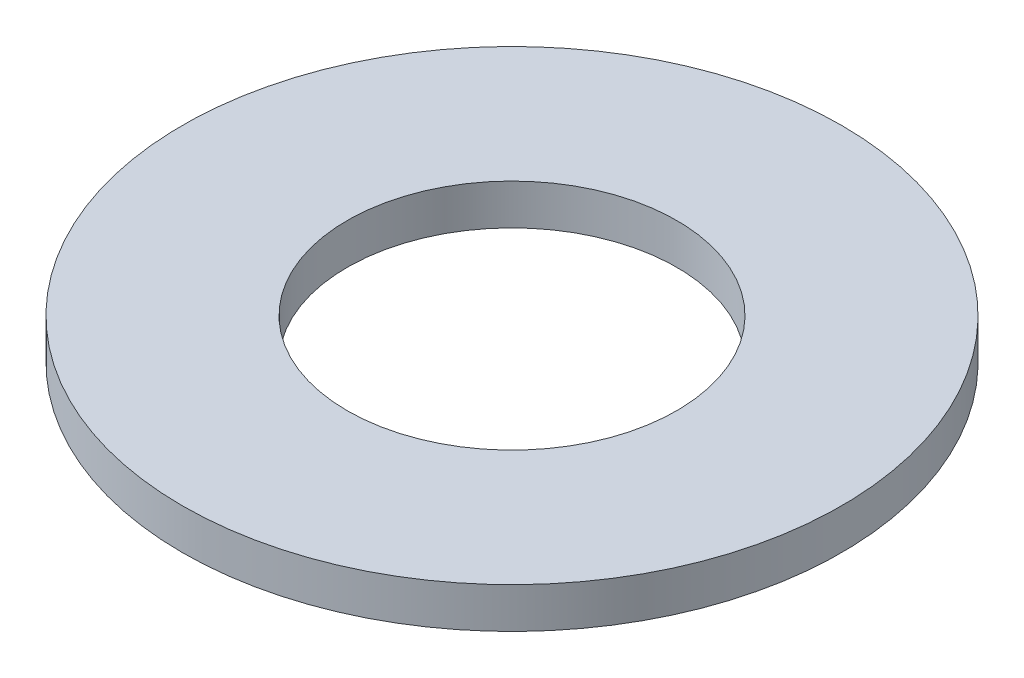
ISO-10303-21;
HEADER;
FILE_DESCRIPTION(('STEP AP214'),'2;1');
FILE_NAME('part.step','',(''),(''),'','','');
FILE_SCHEMA(('AUTOMOTIVE_DESIGN { 1 0 10303 214 1 1 1 1 }'));
ENDSEC;
DATA;
#1=APPLICATION_CONTEXT('core data for automotive mechanical design processes');
#2=APPLICATION_PROTOCOL_DEFINITION('international standard','automotive_design',2000,#1);
#3=PRODUCT_CONTEXT('',#1,'mechanical');
#4=PRODUCT('Part','Part','',(#3));
#5=PRODUCT_RELATED_PRODUCT_CATEGORY('part','',(#4));
#6=PRODUCT_DEFINITION_FORMATION('','',#4);
#7=PRODUCT_DEFINITION_CONTEXT('part definition',#1,'design');
#8=PRODUCT_DEFINITION('design','',#6,#7);
#9=PRODUCT_DEFINITION_SHAPE('','',#8);
#10=(LENGTH_UNIT() NAMED_UNIT(*) SI_UNIT(.MILLI.,.METRE.));
#11=(NAMED_UNIT(*) PLANE_ANGLE_UNIT() SI_UNIT($,.RADIAN.));
#12=(NAMED_UNIT(*) SI_UNIT($,.STERADIAN.) SOLID_ANGLE_UNIT());
#13=UNCERTAINTY_MEASURE_WITH_UNIT(LENGTH_MEASURE(1.E-05),#10,'distance_accuracy_value','');
#14=(GEOMETRIC_REPRESENTATION_CONTEXT(3) GLOBAL_UNCERTAINTY_ASSIGNED_CONTEXT((#13)) GLOBAL_UNIT_ASSIGNED_CONTEXT((#10,
#11,#12)) REPRESENTATION_CONTEXT('',''));
#15=CARTESIAN_POINT('',(0.,0.,0.));
#16=DIRECTION('',(0.,0.,1.));
#17=DIRECTION('',(1.,0.,0.));
#18=AXIS2_PLACEMENT_3D('',#15,#16,#17);
#19=CARTESIAN_POINT('',(0.,0.8,0.));
#20=DIRECTION('',(0.,1.,0.));
#21=DIRECTION('',(0.,0.,1.));
#22=AXIS2_PLACEMENT_3D('',#19,#20,#21);
#23=PLANE('',#22);
#24=CARTESIAN_POINT('',(0.,0.8,0.));
#25=DIRECTION('',(0.,1.,0.));
#26=DIRECTION('',(0.,0.,1.));
#27=AXIS2_PLACEMENT_3D('',#24,#25,#26);
#28=CIRCLE('',#27,6.5);
#29=CARTESIAN_POINT('',(0.,0.8,6.5));
#30=VERTEX_POINT('',#29);
#31=EDGE_CURVE('E10',#30,#30,#28,.T.);
#32=ORIENTED_EDGE('',*,*,#31,.T.);
#33=EDGE_LOOP('',(#32));
#34=FACE_BOUND('',#33,.T.);
#35=CARTESIAN_POINT('',(0.,0.8,0.));
#36=DIRECTION('',(0.,1.,0.));
#37=DIRECTION('',(0.,0.,1.));
#38=AXIS2_PLACEMENT_3D('',#35,#36,#37);
#39=CIRCLE('',#38,3.25);
#40=CARTESIAN_POINT('',(0.,0.8,3.25));
#41=VERTEX_POINT('',#40);
#42=EDGE_CURVE('E48',#41,#41,#39,.T.);
#43=ORIENTED_EDGE('',*,*,#42,.F.);
#44=EDGE_LOOP('',(#43));
#45=FACE_BOUND('',#44,.T.);
#46=ADVANCED_FACE('F37',(#34,#45),#23,.T.);
#47=CARTESIAN_POINT('',(0.,0.,0.));
#48=DIRECTION('',(0.,1.,0.));
#49=DIRECTION('',(0.,0.,1.));
#50=AXIS2_PLACEMENT_3D('',#47,#48,#49);
#51=PLANE('',#50);
#52=CARTESIAN_POINT('',(0.,0.,0.));
#53=DIRECTION('',(0.,1.,0.));
#54=DIRECTION('',(0.,0.,1.));
#55=AXIS2_PLACEMENT_3D('',#52,#53,#54);
#56=CIRCLE('',#55,6.5);
#57=CARTESIAN_POINT('',(0.,0.,6.5));
#58=VERTEX_POINT('',#57);
#59=EDGE_CURVE('E41',#58,#58,#56,.T.);
#60=ORIENTED_EDGE('',*,*,#59,.F.);
#61=EDGE_LOOP('',(#60));
#62=FACE_BOUND('',#61,.T.);
#63=CARTESIAN_POINT('',(0.,0.,0.));
#64=DIRECTION('',(0.,1.,0.));
#65=DIRECTION('',(0.,0.,1.));
#66=AXIS2_PLACEMENT_3D('',#63,#64,#65);
#67=CIRCLE('',#66,3.25);
#68=CARTESIAN_POINT('',(0.,0.,3.25));
#69=VERTEX_POINT('',#68);
#70=EDGE_CURVE('E50',#69,#69,#67,.T.);
#71=ORIENTED_EDGE('',*,*,#70,.T.);
#72=EDGE_LOOP('',(#71));
#73=FACE_BOUND('',#72,.T.);
#74=ADVANCED_FACE('F60',(#62,#73),#51,.F.);
#75=CARTESIAN_POINT('',(0.,0.8,0.));
#76=DIRECTION('',(0.,-1.,0.));
#77=DIRECTION('',(0.,0.,-1.));
#78=AXIS2_PLACEMENT_3D('',#75,#76,#77);
#79=CYLINDRICAL_SURFACE('',#78,6.5);
#80=ORIENTED_EDGE('',*,*,#31,.F.);
#81=EDGE_LOOP('',(#80));
#82=FACE_BOUND('',#81,.T.);
#83=ORIENTED_EDGE('',*,*,#59,.T.);
#84=EDGE_LOOP('',(#83));
#85=FACE_BOUND('',#84,.T.);
#86=ADVANCED_FACE('F39',(#82,#85),#79,.T.);
#87=CARTESIAN_POINT('',(0.,0.8,0.));
#88=DIRECTION('',(0.,-1.,0.));
#89=DIRECTION('',(0.,0.,-1.));
#90=AXIS2_PLACEMENT_3D('',#87,#88,#89);
#91=CYLINDRICAL_SURFACE('',#90,3.25);
#92=ORIENTED_EDGE('',*,*,#42,.T.);
#93=EDGE_LOOP('',(#92));
#94=FACE_BOUND('',#93,.T.);
#95=ORIENTED_EDGE('',*,*,#70,.F.);
#96=EDGE_LOOP('',(#95));
#97=FACE_BOUND('',#96,.T.);
#98=ADVANCED_FACE('F56',(#94,#97),#91,.F.);
#99=CLOSED_SHELL('',(#46,#74,#86,#98));
#100=MANIFOLD_SOLID_BREP('B2',#99);
#101=ADVANCED_BREP_SHAPE_REPRESENTATION('',(#18,#100),#14);
#102=SHAPE_DEFINITION_REPRESENTATION(#9,#101);
ENDSEC;
END-ISO-10303-21;
